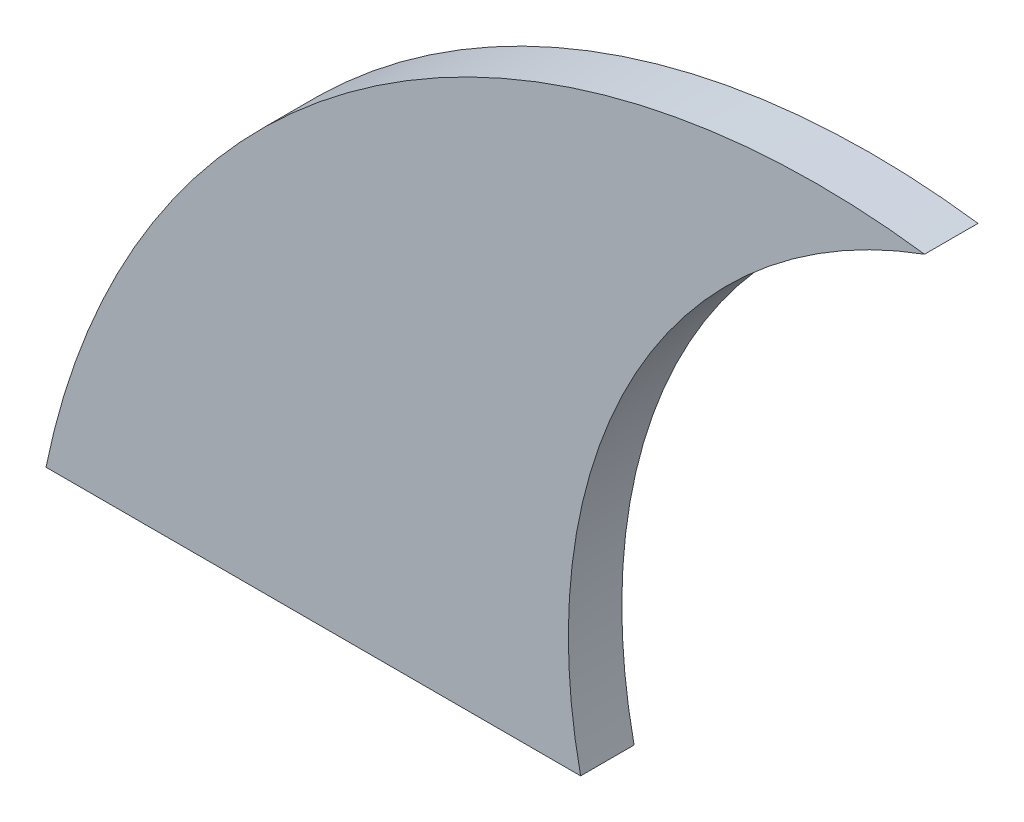
ISO-10303-21;
HEADER;
FILE_DESCRIPTION(('STEP AP214'),'2;1');
FILE_NAME('part.step','',(''),(''),'','','');
FILE_SCHEMA(('AUTOMOTIVE_DESIGN { 1 0 10303 214 1 1 1 1 }'));
ENDSEC;
DATA;
#1=APPLICATION_CONTEXT('core data for automotive mechanical design processes');
#2=APPLICATION_PROTOCOL_DEFINITION('international standard','automotive_design',2000,#1);
#3=PRODUCT_CONTEXT('',#1,'mechanical');
#4=PRODUCT('Part','Part','',(#3));
#5=PRODUCT_RELATED_PRODUCT_CATEGORY('part','',(#4));
#6=PRODUCT_DEFINITION_FORMATION('','',#4);
#7=PRODUCT_DEFINITION_CONTEXT('part definition',#1,'design');
#8=PRODUCT_DEFINITION('design','',#6,#7);
#9=PRODUCT_DEFINITION_SHAPE('','',#8);
#10=(LENGTH_UNIT() NAMED_UNIT(*) SI_UNIT(.MILLI.,.METRE.));
#11=(NAMED_UNIT(*) PLANE_ANGLE_UNIT() SI_UNIT($,.RADIAN.));
#12=(NAMED_UNIT(*) SI_UNIT($,.STERADIAN.) SOLID_ANGLE_UNIT());
#13=UNCERTAINTY_MEASURE_WITH_UNIT(LENGTH_MEASURE(1.E-05),#10,'distance_accuracy_value','');
#14=(GEOMETRIC_REPRESENTATION_CONTEXT(3) GLOBAL_UNCERTAINTY_ASSIGNED_CONTEXT((#13)) GLOBAL_UNIT_ASSIGNED_CONTEXT((#10,
#11,#12)) REPRESENTATION_CONTEXT('',''));
#15=CARTESIAN_POINT('',(0.,0.,0.));
#16=DIRECTION('',(0.,0.,1.));
#17=DIRECTION('',(1.,0.,0.));
#18=AXIS2_PLACEMENT_3D('',#15,#16,#17);
#19=CARTESIAN_POINT('',(0.,0.,3.));
#20=DIRECTION('',(0.,1.,0.));
#21=DIRECTION('',(0.,0.,1.));
#22=AXIS2_PLACEMENT_3D('',#19,#20,#21);
#23=PLANE('',#22);
#24=DIRECTION('',(1.,0.,0.));
#25=VECTOR('',#24,1.);
#26=CARTESIAN_POINT('',(0.,0.,0.));
#27=LINE('',#26,#25);
#28=CARTESIAN_POINT('',(0.,0.,0.));
#29=VERTEX_POINT('',#28);
#30=CARTESIAN_POINT('',(30.,0.,0.));
#31=VERTEX_POINT('',#30);
#32=EDGE_CURVE('E82',#29,#31,#27,.T.);
#33=ORIENTED_EDGE('',*,*,#32,.T.);
#34=DIRECTION('',(0.,0.,-1.));
#35=VECTOR('',#34,1.);
#36=CARTESIAN_POINT('',(30.,0.,3.));
#37=LINE('',#36,#35);
#38=CARTESIAN_POINT('',(30.,0.,3.));
#39=VERTEX_POINT('',#38);
#40=EDGE_CURVE('E11',#39,#31,#37,.T.);
#41=ORIENTED_EDGE('',*,*,#40,.F.);
#42=DIRECTION('',(1.,0.,0.));
#43=VECTOR('',#42,1.);
#44=CARTESIAN_POINT('',(0.,0.,3.));
#45=LINE('',#44,#43);
#46=CARTESIAN_POINT('',(0.,0.,3.));
#47=VERTEX_POINT('',#46);
#48=EDGE_CURVE('E77',#47,#39,#45,.T.);
#49=ORIENTED_EDGE('',*,*,#48,.F.);
#50=DIRECTION('',(0.,0.,-1.));
#51=VECTOR('',#50,1.);
#52=CARTESIAN_POINT('',(0.,0.,3.));
#53=LINE('',#52,#51);
#54=EDGE_CURVE('E52',#47,#29,#53,.T.);
#55=ORIENTED_EDGE('',*,*,#54,.T.);
#56=EDGE_LOOP('',(#33,#41,#49,#55));
#57=FACE_BOUND('',#56,.T.);
#58=ADVANCED_FACE('F36',(#57),#23,.F.);
#59=CARTESIAN_POINT('',(59.7129949476274,6.43721335605473,3.));
#60=DIRECTION('',(0.,0.,-1.));
#61=DIRECTION('',(-1.,0.,0.));
#62=AXIS2_PLACEMENT_3D('',#59,#60,#61);
#63=CYLINDRICAL_SURFACE('',#62,30.4022990010476);
#64=CARTESIAN_POINT('',(59.7129949476274,6.43721335605473,0.));
#65=DIRECTION('',(0.,0.,-1.));
#66=DIRECTION('',(-1.,0.,0.));
#67=AXIS2_PLACEMENT_3D('',#64,#65,#66);
#68=CIRCLE('',#67,30.4022990010476);
#69=CARTESIAN_POINT('',(49.2982456140351,35.,0.));
#70=VERTEX_POINT('',#69);
#71=EDGE_CURVE('E85',#31,#70,#68,.T.);
#72=ORIENTED_EDGE('',*,*,#71,.T.);
#73=DIRECTION('',(0.,0.,-1.));
#74=VECTOR('',#73,1.);
#75=CARTESIAN_POINT('',(49.2982456140351,35.,3.));
#76=LINE('',#75,#74);
#77=CARTESIAN_POINT('',(49.2982456140351,35.,3.));
#78=VERTEX_POINT('',#77);
#79=EDGE_CURVE('E44',#78,#70,#76,.T.);
#80=ORIENTED_EDGE('',*,*,#79,.F.);
#81=CARTESIAN_POINT('',(59.7129949476274,6.43721335605473,3.));
#82=DIRECTION('',(0.,0.,-1.));
#83=DIRECTION('',(-1.,0.,0.));
#84=AXIS2_PLACEMENT_3D('',#81,#82,#83);
#85=CIRCLE('',#84,30.4022990010476);
#86=EDGE_CURVE('E70',#39,#78,#85,.T.);
#87=ORIENTED_EDGE('',*,*,#86,.F.);
#88=ORIENTED_EDGE('',*,*,#40,.T.);
#89=EDGE_LOOP('',(#72,#80,#87,#88));
#90=FACE_BOUND('',#89,.T.);
#91=ADVANCED_FACE('F72',(#90),#63,.F.);
#92=CARTESIAN_POINT('',(43.312946160255,-8.78839279328186,3.));
#93=DIRECTION('',(0.,0.,-1.));
#94=DIRECTION('',(-1.,0.,0.));
#95=AXIS2_PLACEMENT_3D('',#92,#93,#94);
#96=CYLINDRICAL_SURFACE('',#95,44.1955558056481);
#97=CARTESIAN_POINT('',(43.312946160255,-8.78839279328186,0.));
#98=DIRECTION('',(0.,0.,-1.));
#99=DIRECTION('',(-1.,0.,0.));
#100=AXIS2_PLACEMENT_3D('',#97,#98,#99);
#101=CIRCLE('',#100,44.1955558056481);
#102=EDGE_CURVE('E80',#29,#70,#101,.T.);
#103=ORIENTED_EDGE('',*,*,#102,.F.);
#104=ORIENTED_EDGE('',*,*,#54,.F.);
#105=CARTESIAN_POINT('',(43.312946160255,-8.78839279328186,3.));
#106=DIRECTION('',(0.,0.,-1.));
#107=DIRECTION('',(-1.,0.,0.));
#108=AXIS2_PLACEMENT_3D('',#105,#106,#107);
#109=CIRCLE('',#108,44.1955558056481);
#110=EDGE_CURVE('E76',#47,#78,#109,.T.);
#111=ORIENTED_EDGE('',*,*,#110,.T.);
#112=ORIENTED_EDGE('',*,*,#79,.T.);
#113=EDGE_LOOP('',(#103,#104,#111,#112));
#114=FACE_BOUND('',#113,.T.);
#115=ADVANCED_FACE('F91',(#114),#96,.T.);
#116=CARTESIAN_POINT('',(59.7129949476274,6.43721335605473,3.));
#117=DIRECTION('',(0.,0.,-1.));
#118=DIRECTION('',(-1.,0.,0.));
#119=AXIS2_PLACEMENT_3D('',#116,#117,#118);
#120=PLANE('',#119);
#121=ORIENTED_EDGE('',*,*,#48,.T.);
#122=ORIENTED_EDGE('',*,*,#86,.T.);
#123=ORIENTED_EDGE('',*,*,#110,.F.);
#124=EDGE_LOOP('',(#121,#122,#123));
#125=FACE_BOUND('',#124,.T.);
#126=ADVANCED_FACE('F79',(#125),#120,.F.);
#127=CARTESIAN_POINT('',(59.7129949476274,6.43721335605473,0.));
#128=DIRECTION('',(0.,0.,-1.));
#129=DIRECTION('',(-1.,0.,0.));
#130=AXIS2_PLACEMENT_3D('',#127,#128,#129);
#131=PLANE('',#130);
#132=ORIENTED_EDGE('',*,*,#32,.F.);
#133=ORIENTED_EDGE('',*,*,#102,.T.);
#134=ORIENTED_EDGE('',*,*,#71,.F.);
#135=EDGE_LOOP('',(#132,#133,#134));
#136=FACE_BOUND('',#135,.T.);
#137=ADVANCED_FACE('F98',(#136),#131,.T.);
#138=CLOSED_SHELL('',(#58,#91,#115,#126,#137));
#139=MANIFOLD_SOLID_BREP('B2',#138);
#140=ADVANCED_BREP_SHAPE_REPRESENTATION('',(#18,#139),#14);
#141=SHAPE_DEFINITION_REPRESENTATION(#9,#140);
ENDSEC;
END-ISO-10303-21;
